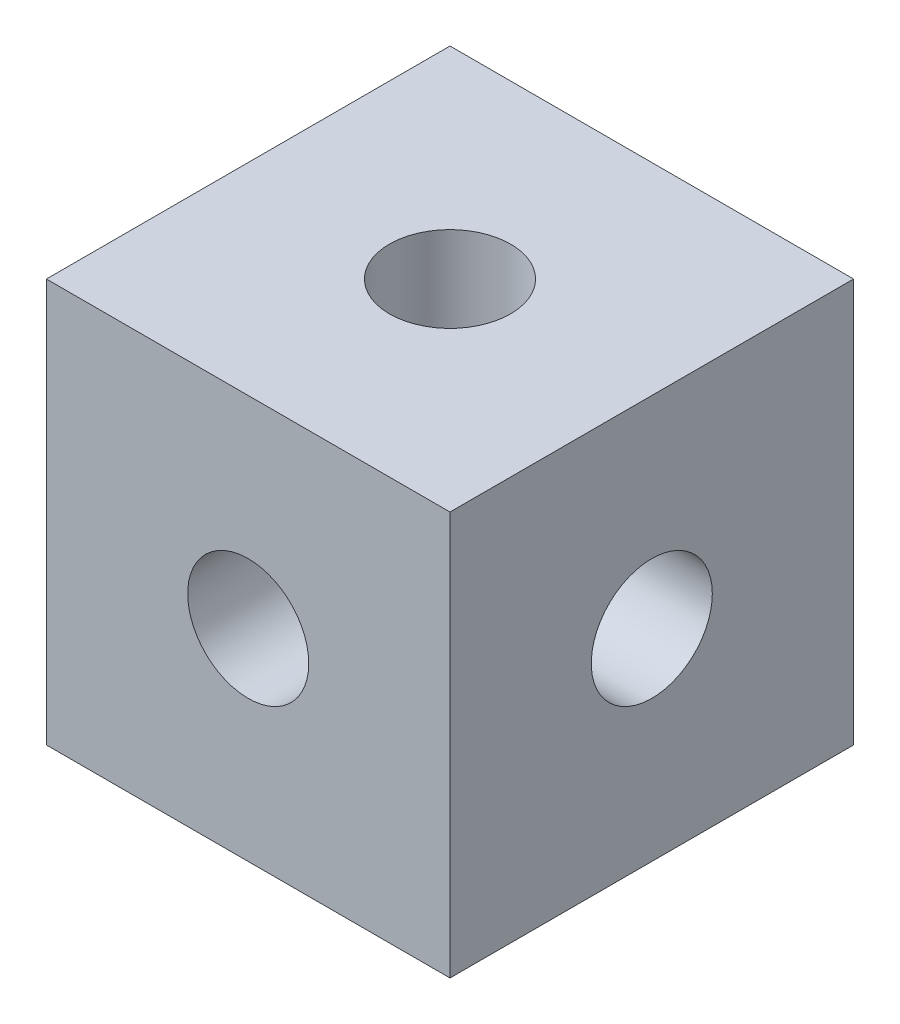
ISO-10303-21;
HEADER;
FILE_DESCRIPTION(('STEP AP214'),'2;1');
FILE_NAME('part.step','',(''),(''),'','','');
FILE_SCHEMA(('AUTOMOTIVE_DESIGN { 1 0 10303 214 1 1 1 1 }'));
ENDSEC;
DATA;
#1=APPLICATION_CONTEXT('core data for automotive mechanical design processes');
#2=APPLICATION_PROTOCOL_DEFINITION('international standard','automotive_design',2000,#1);
#3=PRODUCT_CONTEXT('',#1,'mechanical');
#4=PRODUCT('Part','Part','',(#3));
#5=PRODUCT_RELATED_PRODUCT_CATEGORY('part','',(#4));
#6=PRODUCT_DEFINITION_FORMATION('','',#4);
#7=PRODUCT_DEFINITION_CONTEXT('part definition',#1,'design');
#8=PRODUCT_DEFINITION('design','',#6,#7);
#9=PRODUCT_DEFINITION_SHAPE('','',#8);
#10=(LENGTH_UNIT() NAMED_UNIT(*) SI_UNIT(.MILLI.,.METRE.));
#11=(NAMED_UNIT(*) PLANE_ANGLE_UNIT() SI_UNIT($,.RADIAN.));
#12=(NAMED_UNIT(*) SI_UNIT($,.STERADIAN.) SOLID_ANGLE_UNIT());
#13=UNCERTAINTY_MEASURE_WITH_UNIT(LENGTH_MEASURE(1.E-05),#10,'distance_accuracy_value','');
#14=(GEOMETRIC_REPRESENTATION_CONTEXT(3) GLOBAL_UNCERTAINTY_ASSIGNED_CONTEXT((#13)) GLOBAL_UNIT_ASSIGNED_CONTEXT((#10,
#11,#12)) REPRESENTATION_CONTEXT('',''));
#15=CARTESIAN_POINT('',(0.,0.,0.));
#16=DIRECTION('',(0.,0.,1.));
#17=DIRECTION('',(1.,0.,0.));
#18=AXIS2_PLACEMENT_3D('',#15,#16,#17);
#19=CARTESIAN_POINT('',(5.,5.,-10.));
#20=DIRECTION('',(0.,0.,1.));
#21=DIRECTION('',(1.,0.,0.));
#22=AXIS2_PLACEMENT_3D('',#19,#20,#21);
#23=CYLINDRICAL_SURFACE('',#22,1.5);
#24=CARTESIAN_POINT('',(5.,5.,0.));
#25=DIRECTION('',(0.,0.,1.));
#26=DIRECTION('',(1.,0.,0.));
#27=AXIS2_PLACEMENT_3D('',#24,#25,#26);
#28=CIRCLE('',#27,1.5);
#29=CARTESIAN_POINT('',(6.5,5.,0.));
#30=VERTEX_POINT('',#29);
#31=EDGE_CURVE('E182',#30,#30,#28,.T.);
#32=ORIENTED_EDGE('',*,*,#31,.T.);
#33=EDGE_LOOP('',(#32));
#34=FACE_BOUND('',#33,.T.);
#35=CARTESIAN_POINT('',(5.,5.,-5.));
#36=DIRECTION('',(-0.707106781186547,0.,0.707106781186547));
#37=DIRECTION('',(0.707106781186547,0.,0.707106781186547));
#38=AXIS2_PLACEMENT_3D('',#35,#36,#37);
#39=ELLIPSE('',#38,2.12132034355964,1.5);
#40=CARTESIAN_POINT('',(6.06066017177982,6.06066017177982,-3.93933982822018));
#41=VERTEX_POINT('',#40);
#42=CARTESIAN_POINT('',(6.06066017177982,3.93933982822018,-3.93933982822018));
#43=VERTEX_POINT('',#42);
#44=EDGE_CURVE('E121',#41,#43,#39,.F.);
#45=ORIENTED_EDGE('',*,*,#44,.T.);
#46=CARTESIAN_POINT('',(5.,5.,-5.));
#47=DIRECTION('',(0.,0.707106781186547,0.707106781186547));
#48=DIRECTION('',(0.,-0.707106781186547,0.707106781186547));
#49=AXIS2_PLACEMENT_3D('',#46,#47,#48);
#50=ELLIPSE('',#49,2.12132034355964,1.5);
#51=CARTESIAN_POINT('',(3.93933982822018,3.93933982822018,-3.93933982822018));
#52=VERTEX_POINT('',#51);
#53=EDGE_CURVE('E108',#43,#52,#50,.F.);
#54=ORIENTED_EDGE('',*,*,#53,.T.);
#55=CARTESIAN_POINT('',(5.,5.,-5.));
#56=DIRECTION('',(0.707106781186547,0.,0.707106781186547));
#57=DIRECTION('',(-0.707106781186547,0.,0.707106781186547));
#58=AXIS2_PLACEMENT_3D('',#55,#56,#57);
#59=ELLIPSE('',#58,2.12132034355964,1.5);
#60=CARTESIAN_POINT('',(3.93933982822018,6.06066017177982,-3.93933982822018));
#61=VERTEX_POINT('',#60);
#62=EDGE_CURVE('E117',#52,#61,#59,.F.);
#63=ORIENTED_EDGE('',*,*,#62,.T.);
#64=CARTESIAN_POINT('',(5.,5.,-5.));
#65=DIRECTION('',(0.,-0.707106781186547,0.707106781186547));
#66=DIRECTION('',(0.,0.707106781186547,0.707106781186547));
#67=AXIS2_PLACEMENT_3D('',#64,#65,#66);
#68=ELLIPSE('',#67,2.12132034355964,1.5);
#69=EDGE_CURVE('E62',#61,#41,#68,.F.);
#70=ORIENTED_EDGE('',*,*,#69,.T.);
#71=EDGE_LOOP('',(#45,#54,#63,#70));
#72=FACE_BOUND('',#71,.T.);
#73=ADVANCED_FACE('F44',(#34,#72),#23,.F.);
#74=CARTESIAN_POINT('',(0.,10.,0.));
#75=DIRECTION('',(1.,0.,0.));
#76=DIRECTION('',(0.,0.,-1.));
#77=AXIS2_PLACEMENT_3D('',#74,#75,#76);
#78=PLANE('',#77);
#79=CARTESIAN_POINT('',(0.,5.,-5.));
#80=DIRECTION('',(1.,0.,0.));
#81=DIRECTION('',(0.,0.,-1.));
#82=AXIS2_PLACEMENT_3D('',#79,#80,#81);
#83=CIRCLE('',#82,1.5);
#84=CARTESIAN_POINT('',(0.,5.,-6.5));
#85=VERTEX_POINT('',#84);
#86=EDGE_CURVE('E183',#85,#85,#83,.T.);
#87=ORIENTED_EDGE('',*,*,#86,.T.);
#88=EDGE_LOOP('',(#87));
#89=FACE_BOUND('',#88,.T.);
#90=DIRECTION('',(0.,0.,1.));
#91=VECTOR('',#90,1.);
#92=CARTESIAN_POINT('',(0.,0.,0.));
#93=LINE('',#92,#91);
#94=CARTESIAN_POINT('',(0.,0.,-10.));
#95=VERTEX_POINT('',#94);
#96=CARTESIAN_POINT('',(0.,0.,0.));
#97=VERTEX_POINT('',#96);
#98=EDGE_CURVE('E164',#95,#97,#93,.T.);
#99=ORIENTED_EDGE('',*,*,#98,.T.);
#100=DIRECTION('',(0.,-1.,0.));
#101=VECTOR('',#100,1.);
#102=CARTESIAN_POINT('',(0.,10.,0.));
#103=LINE('',#102,#101);
#104=CARTESIAN_POINT('',(0.,10.,0.));
#105=VERTEX_POINT('',#104);
#106=EDGE_CURVE('E137',#105,#97,#103,.T.);
#107=ORIENTED_EDGE('',*,*,#106,.F.);
#108=DIRECTION('',(0.,0.,1.));
#109=VECTOR('',#108,1.);
#110=CARTESIAN_POINT('',(0.,10.,0.));
#111=LINE('',#110,#109);
#112=CARTESIAN_POINT('',(0.,10.,-10.));
#113=VERTEX_POINT('',#112);
#114=EDGE_CURVE('E158',#113,#105,#111,.T.);
#115=ORIENTED_EDGE('',*,*,#114,.F.);
#116=DIRECTION('',(0.,-1.,0.));
#117=VECTOR('',#116,1.);
#118=CARTESIAN_POINT('',(0.,10.,-10.));
#119=LINE('',#118,#117);
#120=EDGE_CURVE('E147',#113,#95,#119,.T.);
#121=ORIENTED_EDGE('',*,*,#120,.T.);
#122=EDGE_LOOP('',(#99,#107,#115,#121));
#123=FACE_BOUND('',#122,.T.);
#124=ADVANCED_FACE('F50',(#89,#123),#78,.F.);
#125=CARTESIAN_POINT('',(0.,10.,0.));
#126=DIRECTION('',(0.,0.,-1.));
#127=DIRECTION('',(-1.,0.,0.));
#128=AXIS2_PLACEMENT_3D('',#125,#126,#127);
#129=PLANE('',#128);
#130=ORIENTED_EDGE('',*,*,#31,.F.);
#131=EDGE_LOOP('',(#130));
#132=FACE_BOUND('',#131,.T.);
#133=DIRECTION('',(1.,0.,0.));
#134=VECTOR('',#133,1.);
#135=CARTESIAN_POINT('',(0.,0.,0.));
#136=LINE('',#135,#134);
#137=CARTESIAN_POINT('',(10.,0.,0.));
#138=VERTEX_POINT('',#137);
#139=EDGE_CURVE('E165',#97,#138,#136,.T.);
#140=ORIENTED_EDGE('',*,*,#139,.T.);
#141=DIRECTION('',(0.,-1.,0.));
#142=VECTOR('',#141,1.);
#143=CARTESIAN_POINT('',(10.,10.,0.));
#144=LINE('',#143,#142);
#145=CARTESIAN_POINT('',(10.,10.,0.));
#146=VERTEX_POINT('',#145);
#147=EDGE_CURVE('E142',#146,#138,#144,.T.);
#148=ORIENTED_EDGE('',*,*,#147,.F.);
#149=DIRECTION('',(1.,0.,0.));
#150=VECTOR('',#149,1.);
#151=CARTESIAN_POINT('',(0.,10.,0.));
#152=LINE('',#151,#150);
#153=EDGE_CURVE('E173',#105,#146,#152,.T.);
#154=ORIENTED_EDGE('',*,*,#153,.F.);
#155=ORIENTED_EDGE('',*,*,#106,.T.);
#156=EDGE_LOOP('',(#140,#148,#154,#155));
#157=FACE_BOUND('',#156,.T.);
#158=ADVANCED_FACE('F245',(#132,#157),#129,.F.);
#159=CARTESIAN_POINT('',(10.,10.,0.));
#160=DIRECTION('',(-1.,0.,0.));
#161=DIRECTION('',(0.,0.,1.));
#162=AXIS2_PLACEMENT_3D('',#159,#160,#161);
#163=PLANE('',#162);
#164=CARTESIAN_POINT('',(10.,5.,-5.));
#165=DIRECTION('',(1.,0.,0.));
#166=DIRECTION('',(0.,0.,-1.));
#167=AXIS2_PLACEMENT_3D('',#164,#165,#166);
#168=CIRCLE('',#167,1.5);
#169=CARTESIAN_POINT('',(10.,5.,-6.5));
#170=VERTEX_POINT('',#169);
#171=EDGE_CURVE('E186',#170,#170,#168,.T.);
#172=ORIENTED_EDGE('',*,*,#171,.F.);
#173=EDGE_LOOP('',(#172));
#174=FACE_BOUND('',#173,.T.);
#175=DIRECTION('',(0.,0.,-1.));
#176=VECTOR('',#175,1.);
#177=CARTESIAN_POINT('',(10.,0.,0.));
#178=LINE('',#177,#176);
#179=CARTESIAN_POINT('',(10.,0.,-10.));
#180=VERTEX_POINT('',#179);
#181=EDGE_CURVE('E157',#138,#180,#178,.T.);
#182=ORIENTED_EDGE('',*,*,#181,.T.);
#183=DIRECTION('',(0.,-1.,0.));
#184=VECTOR('',#183,1.);
#185=CARTESIAN_POINT('',(10.,10.,-10.));
#186=LINE('',#185,#184);
#187=CARTESIAN_POINT('',(10.,10.,-10.));
#188=VERTEX_POINT('',#187);
#189=EDGE_CURVE('E148',#188,#180,#186,.T.);
#190=ORIENTED_EDGE('',*,*,#189,.F.);
#191=DIRECTION('',(0.,0.,-1.));
#192=VECTOR('',#191,1.);
#193=CARTESIAN_POINT('',(10.,10.,0.));
#194=LINE('',#193,#192);
#195=EDGE_CURVE('E175',#146,#188,#194,.T.);
#196=ORIENTED_EDGE('',*,*,#195,.F.);
#197=ORIENTED_EDGE('',*,*,#147,.T.);
#198=EDGE_LOOP('',(#182,#190,#196,#197));
#199=FACE_BOUND('',#198,.T.);
#200=ADVANCED_FACE('F261',(#174,#199),#163,.F.);
#201=CARTESIAN_POINT('',(0.,10.,-10.));
#202=DIRECTION('',(0.,0.,1.));
#203=DIRECTION('',(1.,0.,0.));
#204=AXIS2_PLACEMENT_3D('',#201,#202,#203);
#205=PLANE('',#204);
#206=CARTESIAN_POINT('',(5.,5.,-10.));
#207=DIRECTION('',(0.,0.,1.));
#208=DIRECTION('',(1.,0.,0.));
#209=AXIS2_PLACEMENT_3D('',#206,#207,#208);
#210=CIRCLE('',#209,1.5);
#211=CARTESIAN_POINT('',(6.5,5.,-10.));
#212=VERTEX_POINT('',#211);
#213=EDGE_CURVE('E166',#212,#212,#210,.T.);
#214=ORIENTED_EDGE('',*,*,#213,.T.);
#215=EDGE_LOOP('',(#214));
#216=FACE_BOUND('',#215,.T.);
#217=DIRECTION('',(-1.,0.,0.));
#218=VECTOR('',#217,1.);
#219=CARTESIAN_POINT('',(0.,0.,-10.));
#220=LINE('',#219,#218);
#221=EDGE_CURVE('E154',#180,#95,#220,.T.);
#222=ORIENTED_EDGE('',*,*,#221,.T.);
#223=ORIENTED_EDGE('',*,*,#120,.F.);
#224=DIRECTION('',(-1.,0.,0.));
#225=VECTOR('',#224,1.);
#226=CARTESIAN_POINT('',(0.,10.,-10.));
#227=LINE('',#226,#225);
#228=EDGE_CURVE('E152',#188,#113,#227,.T.);
#229=ORIENTED_EDGE('',*,*,#228,.F.);
#230=ORIENTED_EDGE('',*,*,#189,.T.);
#231=EDGE_LOOP('',(#222,#223,#229,#230));
#232=FACE_BOUND('',#231,.T.);
#233=ADVANCED_FACE('F256',(#216,#232),#205,.F.);
#234=CARTESIAN_POINT('',(0.,10.,0.));
#235=DIRECTION('',(0.,-1.,0.));
#236=DIRECTION('',(0.,0.,-1.));
#237=AXIS2_PLACEMENT_3D('',#234,#235,#236);
#238=PLANE('',#237);
#239=CARTESIAN_POINT('',(5.,10.,-5.));
#240=DIRECTION('',(0.,1.,0.));
#241=DIRECTION('',(0.,0.,1.));
#242=AXIS2_PLACEMENT_3D('',#239,#240,#241);
#243=CIRCLE('',#242,1.5);
#244=CARTESIAN_POINT('',(5.,10.,-3.5));
#245=VERTEX_POINT('',#244);
#246=EDGE_CURVE('E211',#245,#245,#243,.T.);
#247=ORIENTED_EDGE('',*,*,#246,.F.);
#248=EDGE_LOOP('',(#247));
#249=FACE_BOUND('',#248,.T.);
#250=ORIENTED_EDGE('',*,*,#114,.T.);
#251=ORIENTED_EDGE('',*,*,#153,.T.);
#252=ORIENTED_EDGE('',*,*,#195,.T.);
#253=ORIENTED_EDGE('',*,*,#228,.T.);
#254=EDGE_LOOP('',(#250,#251,#252,#253));
#255=FACE_BOUND('',#254,.T.);
#256=ADVANCED_FACE('F252',(#249,#255),#238,.F.);
#257=CARTESIAN_POINT('',(0.,0.,0.));
#258=DIRECTION('',(0.,-1.,0.));
#259=DIRECTION('',(0.,0.,-1.));
#260=AXIS2_PLACEMENT_3D('',#257,#258,#259);
#261=PLANE('',#260);
#262=CARTESIAN_POINT('',(5.,0.,-5.));
#263=DIRECTION('',(0.,1.,0.));
#264=DIRECTION('',(0.,0.,1.));
#265=AXIS2_PLACEMENT_3D('',#262,#263,#264);
#266=CIRCLE('',#265,1.5);
#267=CARTESIAN_POINT('',(5.,0.,-3.5));
#268=VERTEX_POINT('',#267);
#269=EDGE_CURVE('E209',#268,#268,#266,.T.);
#270=ORIENTED_EDGE('',*,*,#269,.T.);
#271=EDGE_LOOP('',(#270));
#272=FACE_BOUND('',#271,.T.);
#273=ORIENTED_EDGE('',*,*,#98,.F.);
#274=ORIENTED_EDGE('',*,*,#221,.F.);
#275=ORIENTED_EDGE('',*,*,#181,.F.);
#276=ORIENTED_EDGE('',*,*,#139,.F.);
#277=EDGE_LOOP('',(#273,#274,#275,#276));
#278=FACE_BOUND('',#277,.T.);
#279=ADVANCED_FACE('F218',(#272,#278),#261,.T.);
#280=CARTESIAN_POINT('',(5.,5.,-5.));
#281=DIRECTION('',(0.707106781186547,0.,0.707106781186547));
#282=DIRECTION('',(-0.707106781186547,0.,0.707106781186547));
#283=AXIS2_PLACEMENT_3D('',#280,#281,#282);
#284=ELLIPSE('',#283,2.12132034355964,1.5);
#285=CARTESIAN_POINT('',(6.06066017177982,3.93933982822018,-6.06066017177982));
#286=VERTEX_POINT('',#285);
#287=CARTESIAN_POINT('',(6.06066017177982,6.06066017177982,-6.06066017177982));
#288=VERTEX_POINT('',#287);
#289=EDGE_CURVE('E130',#286,#288,#284,.T.);
#290=ORIENTED_EDGE('',*,*,#289,.T.);
#291=CARTESIAN_POINT('',(5.,5.,-5.));
#292=DIRECTION('',(0.,0.707106781186547,0.707106781186547));
#293=DIRECTION('',(0.,-0.707106781186547,0.707106781186547));
#294=AXIS2_PLACEMENT_3D('',#291,#292,#293);
#295=ELLIPSE('',#294,2.12132034355964,1.5);
#296=CARTESIAN_POINT('',(3.93933982822018,6.06066017177982,-6.06066017177982));
#297=VERTEX_POINT('',#296);
#298=EDGE_CURVE('E205',#288,#297,#295,.T.);
#299=ORIENTED_EDGE('',*,*,#298,.T.);
#300=CARTESIAN_POINT('',(5.,5.,-5.));
#301=DIRECTION('',(-0.707106781186547,0.,0.707106781186547));
#302=DIRECTION('',(0.707106781186547,0.,0.707106781186547));
#303=AXIS2_PLACEMENT_3D('',#300,#301,#302);
#304=ELLIPSE('',#303,2.12132034355964,1.5);
#305=CARTESIAN_POINT('',(3.93933982822018,3.93933982822018,-6.06066017177982));
#306=VERTEX_POINT('',#305);
#307=EDGE_CURVE('E132',#297,#306,#304,.T.);
#308=ORIENTED_EDGE('',*,*,#307,.T.);
#309=CARTESIAN_POINT('',(5.,5.,-5.));
#310=DIRECTION('',(0.,-0.707106781186547,0.707106781186547));
#311=DIRECTION('',(0.,0.707106781186547,0.707106781186547));
#312=AXIS2_PLACEMENT_3D('',#309,#310,#311);
#313=ELLIPSE('',#312,2.12132034355964,1.5);
#314=EDGE_CURVE('E67',#306,#286,#313,.T.);
#315=ORIENTED_EDGE('',*,*,#314,.T.);
#316=EDGE_LOOP('',(#290,#299,#308,#315));
#317=FACE_BOUND('',#316,.T.);
#318=ORIENTED_EDGE('',*,*,#213,.F.);
#319=EDGE_LOOP('',(#318));
#320=FACE_BOUND('',#319,.T.);
#321=ADVANCED_FACE('F237',(#317,#320),#23,.F.);
#322=CARTESIAN_POINT('',(0.,5.,-5.));
#323=DIRECTION('',(1.,0.,0.));
#324=DIRECTION('',(0.,0.,-1.));
#325=AXIS2_PLACEMENT_3D('',#322,#323,#324);
#326=CYLINDRICAL_SURFACE('',#325,1.5);
#327=ORIENTED_EDGE('',*,*,#171,.T.);
#328=EDGE_LOOP('',(#327));
#329=FACE_BOUND('',#328,.T.);
#330=ORIENTED_EDGE('',*,*,#289,.F.);
#331=CARTESIAN_POINT('',(5.,5.,-5.));
#332=DIRECTION('',(0.707106781186547,0.707106781186547,0.));
#333=DIRECTION('',(0.707106781186547,-0.707106781186547,0.));
#334=AXIS2_PLACEMENT_3D('',#331,#332,#333);
#335=ELLIPSE('',#334,2.12132034355964,1.5);
#336=EDGE_CURVE('E122',#286,#43,#335,.F.);
#337=ORIENTED_EDGE('',*,*,#336,.T.);
#338=ORIENTED_EDGE('',*,*,#44,.F.);
#339=CARTESIAN_POINT('',(5.,5.,-5.));
#340=DIRECTION('',(0.707106781186547,-0.707106781186547,0.));
#341=DIRECTION('',(0.707106781186547,0.707106781186547,0.));
#342=AXIS2_PLACEMENT_3D('',#339,#340,#341);
#343=ELLIPSE('',#342,2.12132034355964,1.5);
#344=EDGE_CURVE('E192',#41,#288,#343,.F.);
#345=ORIENTED_EDGE('',*,*,#344,.T.);
#346=EDGE_LOOP('',(#330,#337,#338,#345));
#347=FACE_BOUND('',#346,.T.);
#348=ADVANCED_FACE('F228',(#329,#347),#326,.F.);
#349=ORIENTED_EDGE('',*,*,#86,.F.);
#350=EDGE_LOOP('',(#349));
#351=FACE_BOUND('',#350,.T.);
#352=ORIENTED_EDGE('',*,*,#307,.F.);
#353=CARTESIAN_POINT('',(5.,5.,-5.));
#354=DIRECTION('',(0.707106781186547,0.707106781186547,0.));
#355=DIRECTION('',(0.707106781186547,-0.707106781186547,0.));
#356=AXIS2_PLACEMENT_3D('',#353,#354,#355);
#357=ELLIPSE('',#356,2.12132034355964,1.5);
#358=EDGE_CURVE('E11',#297,#61,#357,.T.);
#359=ORIENTED_EDGE('',*,*,#358,.T.);
#360=ORIENTED_EDGE('',*,*,#62,.F.);
#361=CARTESIAN_POINT('',(5.,5.,-5.));
#362=DIRECTION('',(0.707106781186547,-0.707106781186547,0.));
#363=DIRECTION('',(0.707106781186547,0.707106781186547,0.));
#364=AXIS2_PLACEMENT_3D('',#361,#362,#363);
#365=ELLIPSE('',#364,2.12132034355964,1.5);
#366=EDGE_CURVE('E53',#52,#306,#365,.T.);
#367=ORIENTED_EDGE('',*,*,#366,.T.);
#368=EDGE_LOOP('',(#352,#359,#360,#367));
#369=FACE_BOUND('',#368,.T.);
#370=ADVANCED_FACE('F124',(#351,#369),#326,.F.);
#371=CARTESIAN_POINT('',(5.,0.,-5.));
#372=DIRECTION('',(0.,1.,0.));
#373=DIRECTION('',(0.,0.,1.));
#374=AXIS2_PLACEMENT_3D('',#371,#372,#373);
#375=CYLINDRICAL_SURFACE('',#374,1.5);
#376=ORIENTED_EDGE('',*,*,#269,.F.);
#377=EDGE_LOOP('',(#376));
#378=FACE_BOUND('',#377,.T.);
#379=ORIENTED_EDGE('',*,*,#314,.F.);
#380=ORIENTED_EDGE('',*,*,#366,.F.);
#381=ORIENTED_EDGE('',*,*,#53,.F.);
#382=ORIENTED_EDGE('',*,*,#336,.F.);
#383=EDGE_LOOP('',(#379,#380,#381,#382));
#384=FACE_BOUND('',#383,.T.);
#385=ADVANCED_FACE('F107',(#378,#384),#375,.F.);
#386=ORIENTED_EDGE('',*,*,#246,.T.);
#387=EDGE_LOOP('',(#386));
#388=FACE_BOUND('',#387,.T.);
#389=ORIENTED_EDGE('',*,*,#69,.F.);
#390=ORIENTED_EDGE('',*,*,#358,.F.);
#391=ORIENTED_EDGE('',*,*,#298,.F.);
#392=ORIENTED_EDGE('',*,*,#344,.F.);
#393=EDGE_LOOP('',(#389,#390,#391,#392));
#394=FACE_BOUND('',#393,.T.);
#395=ADVANCED_FACE('F224',(#388,#394),#375,.F.);
#396=CLOSED_SHELL('',(#73,#124,#158,#200,#233,#256,#279,#321,#348,#370,#385,#395));
#397=MANIFOLD_SOLID_BREP('B2',#396);
#398=ADVANCED_BREP_SHAPE_REPRESENTATION('',(#18,#397),#14);
#399=SHAPE_DEFINITION_REPRESENTATION(#9,#398);
ENDSEC;
END-ISO-10303-21;
